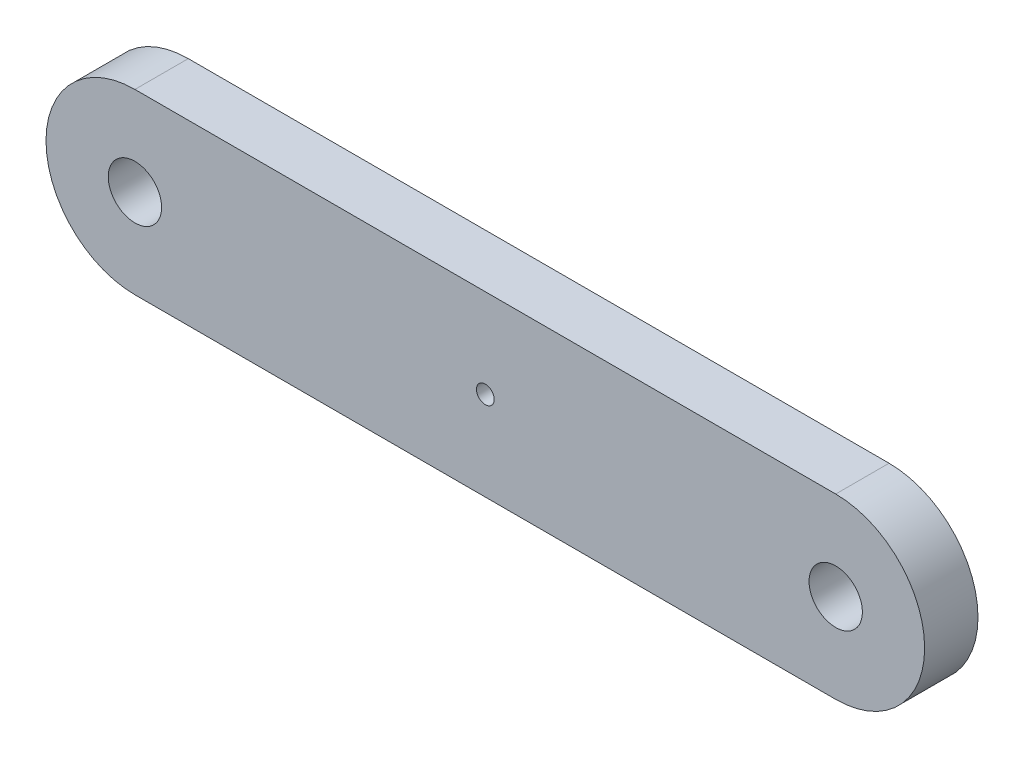
ISO-10303-21;
HEADER;
FILE_DESCRIPTION(('STEP AP214'),'2;1');
FILE_NAME('part.step','',(''),(''),'','','');
FILE_SCHEMA(('AUTOMOTIVE_DESIGN { 1 0 10303 214 1 1 1 1 }'));
ENDSEC;
DATA;
#1=APPLICATION_CONTEXT('core data for automotive mechanical design processes');
#2=APPLICATION_PROTOCOL_DEFINITION('international standard','automotive_design',2000,#1);
#3=PRODUCT_CONTEXT('',#1,'mechanical');
#4=PRODUCT('Part','Part','',(#3));
#5=PRODUCT_RELATED_PRODUCT_CATEGORY('part','',(#4));
#6=PRODUCT_DEFINITION_FORMATION('','',#4);
#7=PRODUCT_DEFINITION_CONTEXT('part definition',#1,'design');
#8=PRODUCT_DEFINITION('design','',#6,#7);
#9=PRODUCT_DEFINITION_SHAPE('','',#8);
#10=(LENGTH_UNIT() NAMED_UNIT(*) SI_UNIT(.MILLI.,.METRE.));
#11=(NAMED_UNIT(*) PLANE_ANGLE_UNIT() SI_UNIT($,.RADIAN.));
#12=(NAMED_UNIT(*) SI_UNIT($,.STERADIAN.) SOLID_ANGLE_UNIT());
#13=UNCERTAINTY_MEASURE_WITH_UNIT(LENGTH_MEASURE(1.E-05),#10,'distance_accuracy_value','');
#14=(GEOMETRIC_REPRESENTATION_CONTEXT(3) GLOBAL_UNCERTAINTY_ASSIGNED_CONTEXT((#13)) GLOBAL_UNIT_ASSIGNED_CONTEXT((#10,
#11,#12)) REPRESENTATION_CONTEXT('',''));
#15=CARTESIAN_POINT('',(0.,0.,0.));
#16=DIRECTION('',(0.,0.,1.));
#17=DIRECTION('',(1.,0.,0.));
#18=AXIS2_PLACEMENT_3D('',#15,#16,#17);
#19=CARTESIAN_POINT('',(0.,0.,3.));
#20=DIRECTION('',(0.,0.,1.));
#21=DIRECTION('',(1.,0.,0.));
#22=AXIS2_PLACEMENT_3D('',#19,#20,#21);
#23=PLANE('',#22);
#24=CARTESIAN_POINT('',(39.4,0.,3.));
#25=DIRECTION('',(0.,0.,1.));
#26=DIRECTION('',(1.,0.,0.));
#27=AXIS2_PLACEMENT_3D('',#24,#25,#26);
#28=CIRCLE('',#27,1.5);
#29=CARTESIAN_POINT('',(40.9,0.,3.));
#30=VERTEX_POINT('',#29);
#31=EDGE_CURVE('E119',#30,#30,#28,.T.);
#32=ORIENTED_EDGE('',*,*,#31,.F.);
#33=EDGE_LOOP('',(#32));
#34=FACE_BOUND('',#33,.T.);
#35=CARTESIAN_POINT('',(0.,0.,3.));
#36=DIRECTION('',(0.,0.,1.));
#37=DIRECTION('',(1.,0.,0.));
#38=AXIS2_PLACEMENT_3D('',#35,#36,#37);
#39=CIRCLE('',#38,5.);
#40=CARTESIAN_POINT('',(0.,5.,3.));
#41=VERTEX_POINT('',#40);
#42=CARTESIAN_POINT('',(0.,-5.,3.));
#43=VERTEX_POINT('',#42);
#44=EDGE_CURVE('E89',#41,#43,#39,.T.);
#45=ORIENTED_EDGE('',*,*,#44,.T.);
#46=DIRECTION('',(1.,0.,0.));
#47=VECTOR('',#46,1.);
#48=CARTESIAN_POINT('',(0.,-5.,3.));
#49=LINE('',#48,#47);
#50=CARTESIAN_POINT('',(39.4,-5.,3.));
#51=VERTEX_POINT('',#50);
#52=EDGE_CURVE('E84',#43,#51,#49,.T.);
#53=ORIENTED_EDGE('',*,*,#52,.T.);
#54=CARTESIAN_POINT('',(39.4,0.,3.));
#55=DIRECTION('',(0.,0.,1.));
#56=DIRECTION('',(1.,0.,0.));
#57=AXIS2_PLACEMENT_3D('',#54,#55,#56);
#58=CIRCLE('',#57,5.);
#59=CARTESIAN_POINT('',(39.4,5.,3.));
#60=VERTEX_POINT('',#59);
#61=EDGE_CURVE('E87',#51,#60,#58,.T.);
#62=ORIENTED_EDGE('',*,*,#61,.T.);
#63=DIRECTION('',(-1.,0.,0.));
#64=VECTOR('',#63,1.);
#65=CARTESIAN_POINT('',(0.,5.,3.));
#66=LINE('',#65,#64);
#67=EDGE_CURVE('E54',#60,#41,#66,.T.);
#68=ORIENTED_EDGE('',*,*,#67,.T.);
#69=EDGE_LOOP('',(#45,#53,#62,#68));
#70=FACE_BOUND('',#69,.T.);
#71=CARTESIAN_POINT('',(0.,0.,3.));
#72=DIRECTION('',(0.,0.,1.));
#73=DIRECTION('',(1.,0.,0.));
#74=AXIS2_PLACEMENT_3D('',#71,#72,#73);
#75=CIRCLE('',#74,1.5);
#76=CARTESIAN_POINT('',(1.5,0.,3.));
#77=VERTEX_POINT('',#76);
#78=EDGE_CURVE('E104',#77,#77,#75,.T.);
#79=ORIENTED_EDGE('',*,*,#78,.F.);
#80=EDGE_LOOP('',(#79));
#81=FACE_BOUND('',#80,.T.);
#82=CARTESIAN_POINT('',(19.7,0.,3.));
#83=DIRECTION('',(0.,0.,1.));
#84=DIRECTION('',(1.,0.,0.));
#85=AXIS2_PLACEMENT_3D('',#82,#83,#84);
#86=CIRCLE('',#85,0.499999999999999);
#87=CARTESIAN_POINT('',(20.2,0.,3.));
#88=VERTEX_POINT('',#87);
#89=EDGE_CURVE('E125',#88,#88,#86,.T.);
#90=ORIENTED_EDGE('',*,*,#89,.F.);
#91=EDGE_LOOP('',(#90));
#92=FACE_BOUND('',#91,.T.);
#93=ADVANCED_FACE('F37',(#34,#70,#81,#92),#23,.T.);
#94=CARTESIAN_POINT('',(0.,0.,0.));
#95=DIRECTION('',(0.,0.,1.));
#96=DIRECTION('',(1.,0.,0.));
#97=AXIS2_PLACEMENT_3D('',#94,#95,#96);
#98=PLANE('',#97);
#99=CARTESIAN_POINT('',(0.,0.,0.));
#100=DIRECTION('',(0.,0.,1.));
#101=DIRECTION('',(1.,0.,0.));
#102=AXIS2_PLACEMENT_3D('',#99,#100,#101);
#103=CIRCLE('',#102,5.);
#104=CARTESIAN_POINT('',(0.,5.,0.));
#105=VERTEX_POINT('',#104);
#106=CARTESIAN_POINT('',(0.,-5.,0.));
#107=VERTEX_POINT('',#106);
#108=EDGE_CURVE('E101',#105,#107,#103,.T.);
#109=ORIENTED_EDGE('',*,*,#108,.F.);
#110=DIRECTION('',(-1.,0.,0.));
#111=VECTOR('',#110,1.);
#112=CARTESIAN_POINT('',(0.,5.,0.));
#113=LINE('',#112,#111);
#114=CARTESIAN_POINT('',(39.4,5.,0.));
#115=VERTEX_POINT('',#114);
#116=EDGE_CURVE('E77',#115,#105,#113,.T.);
#117=ORIENTED_EDGE('',*,*,#116,.F.);
#118=CARTESIAN_POINT('',(39.4,0.,0.));
#119=DIRECTION('',(0.,0.,1.));
#120=DIRECTION('',(1.,0.,0.));
#121=AXIS2_PLACEMENT_3D('',#118,#119,#120);
#122=CIRCLE('',#121,5.);
#123=CARTESIAN_POINT('',(39.4,-5.,0.));
#124=VERTEX_POINT('',#123);
#125=EDGE_CURVE('E71',#124,#115,#122,.T.);
#126=ORIENTED_EDGE('',*,*,#125,.F.);
#127=DIRECTION('',(1.,0.,0.));
#128=VECTOR('',#127,1.);
#129=CARTESIAN_POINT('',(0.,-5.,0.));
#130=LINE('',#129,#128);
#131=EDGE_CURVE('E93',#107,#124,#130,.T.);
#132=ORIENTED_EDGE('',*,*,#131,.F.);
#133=EDGE_LOOP('',(#109,#117,#126,#132));
#134=FACE_BOUND('',#133,.T.);
#135=CARTESIAN_POINT('',(0.,0.,0.));
#136=DIRECTION('',(0.,0.,1.));
#137=DIRECTION('',(1.,0.,0.));
#138=AXIS2_PLACEMENT_3D('',#135,#136,#137);
#139=CIRCLE('',#138,1.5);
#140=CARTESIAN_POINT('',(1.5,0.,0.));
#141=VERTEX_POINT('',#140);
#142=EDGE_CURVE('E116',#141,#141,#139,.T.);
#143=ORIENTED_EDGE('',*,*,#142,.T.);
#144=EDGE_LOOP('',(#143));
#145=FACE_BOUND('',#144,.T.);
#146=CARTESIAN_POINT('',(39.4,0.,0.));
#147=DIRECTION('',(0.,0.,1.));
#148=DIRECTION('',(1.,0.,0.));
#149=AXIS2_PLACEMENT_3D('',#146,#147,#148);
#150=CIRCLE('',#149,1.5);
#151=CARTESIAN_POINT('',(40.9,0.,0.));
#152=VERTEX_POINT('',#151);
#153=EDGE_CURVE('E122',#152,#152,#150,.T.);
#154=ORIENTED_EDGE('',*,*,#153,.T.);
#155=EDGE_LOOP('',(#154));
#156=FACE_BOUND('',#155,.T.);
#157=CARTESIAN_POINT('',(19.7,0.,0.));
#158=DIRECTION('',(0.,0.,1.));
#159=DIRECTION('',(1.,0.,0.));
#160=AXIS2_PLACEMENT_3D('',#157,#158,#159);
#161=CIRCLE('',#160,0.499999999999999);
#162=CARTESIAN_POINT('',(20.2,0.,0.));
#163=VERTEX_POINT('',#162);
#164=EDGE_CURVE('E128',#163,#163,#161,.T.);
#165=ORIENTED_EDGE('',*,*,#164,.T.);
#166=EDGE_LOOP('',(#165));
#167=FACE_BOUND('',#166,.T.);
#168=ADVANCED_FACE('F112',(#134,#145,#156,#167),#98,.F.);
#169=CARTESIAN_POINT('',(0.,0.,3.));
#170=DIRECTION('',(0.,0.,-1.));
#171=DIRECTION('',(-1.,0.,0.));
#172=AXIS2_PLACEMENT_3D('',#169,#170,#171);
#173=CYLINDRICAL_SURFACE('',#172,5.);
#174=ORIENTED_EDGE('',*,*,#108,.T.);
#175=DIRECTION('',(0.,0.,-1.));
#176=VECTOR('',#175,1.);
#177=CARTESIAN_POINT('',(0.,-5.,3.));
#178=LINE('',#177,#176);
#179=EDGE_CURVE('E11',#43,#107,#178,.T.);
#180=ORIENTED_EDGE('',*,*,#179,.F.);
#181=ORIENTED_EDGE('',*,*,#44,.F.);
#182=DIRECTION('',(0.,0.,-1.));
#183=VECTOR('',#182,1.);
#184=CARTESIAN_POINT('',(0.,5.,3.));
#185=LINE('',#184,#183);
#186=EDGE_CURVE('E97',#41,#105,#185,.T.);
#187=ORIENTED_EDGE('',*,*,#186,.T.);
#188=EDGE_LOOP('',(#174,#180,#181,#187));
#189=FACE_BOUND('',#188,.T.);
#190=ADVANCED_FACE('F39',(#189),#173,.T.);
#191=CARTESIAN_POINT('',(0.,-5.,3.));
#192=DIRECTION('',(0.,1.,0.));
#193=DIRECTION('',(0.,0.,1.));
#194=AXIS2_PLACEMENT_3D('',#191,#192,#193);
#195=PLANE('',#194);
#196=ORIENTED_EDGE('',*,*,#131,.T.);
#197=DIRECTION('',(0.,0.,-1.));
#198=VECTOR('',#197,1.);
#199=CARTESIAN_POINT('',(39.4,-5.,3.));
#200=LINE('',#199,#198);
#201=EDGE_CURVE('E46',#51,#124,#200,.T.);
#202=ORIENTED_EDGE('',*,*,#201,.F.);
#203=ORIENTED_EDGE('',*,*,#52,.F.);
#204=ORIENTED_EDGE('',*,*,#179,.T.);
#205=EDGE_LOOP('',(#196,#202,#203,#204));
#206=FACE_BOUND('',#205,.T.);
#207=ADVANCED_FACE('F92',(#206),#195,.F.);
#208=CARTESIAN_POINT('',(39.4,0.,3.));
#209=DIRECTION('',(0.,0.,-1.));
#210=DIRECTION('',(-1.,0.,0.));
#211=AXIS2_PLACEMENT_3D('',#208,#209,#210);
#212=CYLINDRICAL_SURFACE('',#211,5.);
#213=ORIENTED_EDGE('',*,*,#125,.T.);
#214=DIRECTION('',(0.,0.,-1.));
#215=VECTOR('',#214,1.);
#216=CARTESIAN_POINT('',(39.4,5.,3.));
#217=LINE('',#216,#215);
#218=EDGE_CURVE('E94',#60,#115,#217,.T.);
#219=ORIENTED_EDGE('',*,*,#218,.F.);
#220=ORIENTED_EDGE('',*,*,#61,.F.);
#221=ORIENTED_EDGE('',*,*,#201,.T.);
#222=EDGE_LOOP('',(#213,#219,#220,#221));
#223=FACE_BOUND('',#222,.T.);
#224=ADVANCED_FACE('F95',(#223),#212,.T.);
#225=CARTESIAN_POINT('',(0.,5.,3.));
#226=DIRECTION('',(0.,-1.,0.));
#227=DIRECTION('',(0.,0.,-1.));
#228=AXIS2_PLACEMENT_3D('',#225,#226,#227);
#229=PLANE('',#228);
#230=ORIENTED_EDGE('',*,*,#116,.T.);
#231=ORIENTED_EDGE('',*,*,#186,.F.);
#232=ORIENTED_EDGE('',*,*,#67,.F.);
#233=ORIENTED_EDGE('',*,*,#218,.T.);
#234=EDGE_LOOP('',(#230,#231,#232,#233));
#235=FACE_BOUND('',#234,.T.);
#236=ADVANCED_FACE('F109',(#235),#229,.F.);
#237=CARTESIAN_POINT('',(0.,0.,3.));
#238=DIRECTION('',(0.,0.,-1.));
#239=DIRECTION('',(-1.,0.,0.));
#240=AXIS2_PLACEMENT_3D('',#237,#238,#239);
#241=CYLINDRICAL_SURFACE('',#240,1.5);
#242=ORIENTED_EDGE('',*,*,#78,.T.);
#243=EDGE_LOOP('',(#242));
#244=FACE_BOUND('',#243,.T.);
#245=ORIENTED_EDGE('',*,*,#142,.F.);
#246=EDGE_LOOP('',(#245));
#247=FACE_BOUND('',#246,.T.);
#248=ADVANCED_FACE('F146',(#244,#247),#241,.F.);
#249=CARTESIAN_POINT('',(39.4,0.,3.));
#250=DIRECTION('',(0.,0.,-1.));
#251=DIRECTION('',(-1.,0.,0.));
#252=AXIS2_PLACEMENT_3D('',#249,#250,#251);
#253=CYLINDRICAL_SURFACE('',#252,1.5);
#254=ORIENTED_EDGE('',*,*,#31,.T.);
#255=EDGE_LOOP('',(#254));
#256=FACE_BOUND('',#255,.T.);
#257=ORIENTED_EDGE('',*,*,#153,.F.);
#258=EDGE_LOOP('',(#257));
#259=FACE_BOUND('',#258,.T.);
#260=ADVANCED_FACE('F200',(#256,#259),#253,.F.);
#261=CARTESIAN_POINT('',(19.7,0.,3.));
#262=DIRECTION('',(0.,0.,-1.));
#263=DIRECTION('',(-1.,0.,0.));
#264=AXIS2_PLACEMENT_3D('',#261,#262,#263);
#265=CYLINDRICAL_SURFACE('',#264,0.499999999999999);
#266=ORIENTED_EDGE('',*,*,#89,.T.);
#267=EDGE_LOOP('',(#266));
#268=FACE_BOUND('',#267,.T.);
#269=ORIENTED_EDGE('',*,*,#164,.F.);
#270=EDGE_LOOP('',(#269));
#271=FACE_BOUND('',#270,.T.);
#272=ADVANCED_FACE('F134',(#268,#271),#265,.F.);
#273=CLOSED_SHELL('',(#93,#168,#190,#207,#224,#236,#248,#260,#272));
#274=MANIFOLD_SOLID_BREP('B2',#273);
#275=ADVANCED_BREP_SHAPE_REPRESENTATION('',(#18,#274),#14);
#276=SHAPE_DEFINITION_REPRESENTATION(#9,#275);
ENDSEC;
END-ISO-10303-21;
